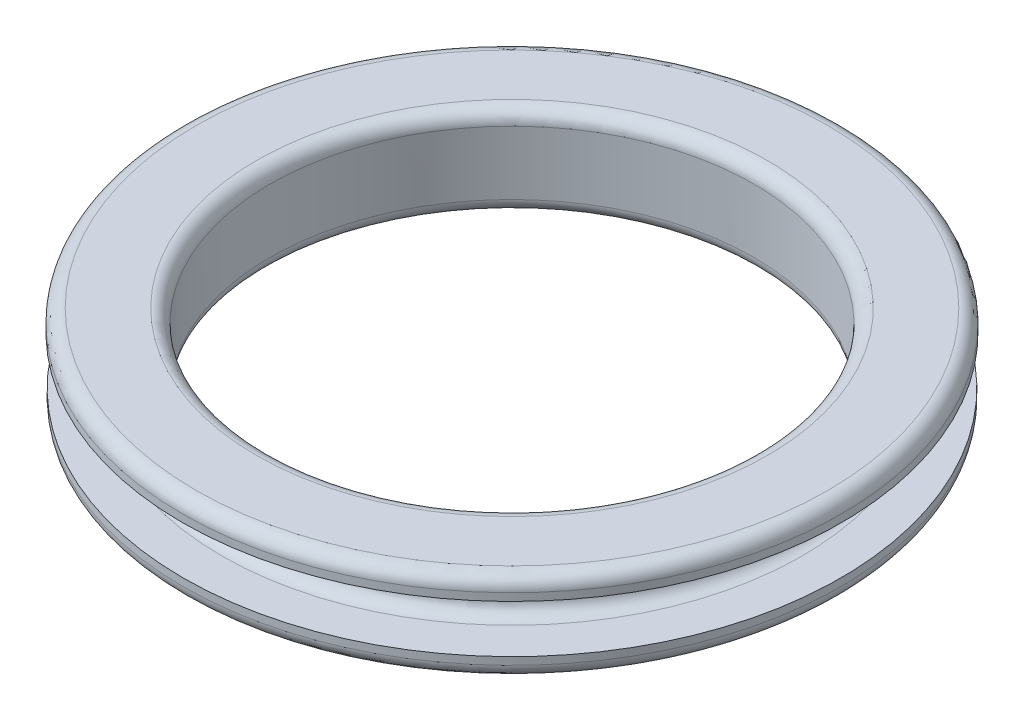
ISO-10303-21;
HEADER;
FILE_DESCRIPTION(('STEP AP214'),'2;1');
FILE_NAME('part.step','',(''),(''),'','','');
FILE_SCHEMA(('AUTOMOTIVE_DESIGN { 1 0 10303 214 1 1 1 1 }'));
ENDSEC;
DATA;
#1=APPLICATION_CONTEXT('core data for automotive mechanical design processes');
#2=APPLICATION_PROTOCOL_DEFINITION('international standard','automotive_design',2000,#1);
#3=PRODUCT_CONTEXT('',#1,'mechanical');
#4=PRODUCT('Part','Part','',(#3));
#5=PRODUCT_RELATED_PRODUCT_CATEGORY('part','',(#4));
#6=PRODUCT_DEFINITION_FORMATION('','',#4);
#7=PRODUCT_DEFINITION_CONTEXT('part definition',#1,'design');
#8=PRODUCT_DEFINITION('design','',#6,#7);
#9=PRODUCT_DEFINITION_SHAPE('','',#8);
#10=(LENGTH_UNIT() NAMED_UNIT(*) SI_UNIT(.MILLI.,.METRE.));
#11=(NAMED_UNIT(*) PLANE_ANGLE_UNIT() SI_UNIT($,.RADIAN.));
#12=(NAMED_UNIT(*) SI_UNIT($,.STERADIAN.) SOLID_ANGLE_UNIT());
#13=UNCERTAINTY_MEASURE_WITH_UNIT(LENGTH_MEASURE(1.E-05),#10,'distance_accuracy_value','');
#14=(GEOMETRIC_REPRESENTATION_CONTEXT(3) GLOBAL_UNCERTAINTY_ASSIGNED_CONTEXT((#13)) GLOBAL_UNIT_ASSIGNED_CONTEXT((#10,
#11,#12)) REPRESENTATION_CONTEXT('',''));
#15=CARTESIAN_POINT('',(0.,0.,0.));
#16=DIRECTION('',(0.,0.,1.));
#17=DIRECTION('',(1.,0.,0.));
#18=AXIS2_PLACEMENT_3D('',#15,#16,#17);
#19=CARTESIAN_POINT('',(-10.8717524104385,0.,0.));
#20=DIRECTION('',(0.,-1.,0.));
#21=DIRECTION('',(0.,0.,-1.));
#22=AXIS2_PLACEMENT_3D('',#19,#20,#21);
#23=PLANE('',#22);
#24=CARTESIAN_POINT('',(0.,0.,0.));
#25=DIRECTION('',(0.,-1.,0.));
#26=DIRECTION('',(0.,0.,-1.));
#27=AXIS2_PLACEMENT_3D('',#24,#25,#26);
#28=CIRCLE('',#27,10.4217524104385);
#29=CARTESIAN_POINT('',(0.,0.,-10.4217524104385));
#30=VERTEX_POINT('',#29);
#31=EDGE_CURVE('E66',#30,#30,#28,.T.);
#32=ORIENTED_EDGE('',*,*,#31,.T.);
#33=EDGE_LOOP('',(#32));
#34=FACE_BOUND('',#33,.T.);
#35=CARTESIAN_POINT('',(0.,0.,0.));
#36=DIRECTION('',(0.,-1.,0.));
#37=DIRECTION('',(0.,0.,-1.));
#38=AXIS2_PLACEMENT_3D('',#35,#36,#37);
#39=CIRCLE('',#38,8.45);
#40=CARTESIAN_POINT('',(0.,0.,-8.45));
#41=VERTEX_POINT('',#40);
#42=EDGE_CURVE('E69',#41,#41,#39,.F.);
#43=ORIENTED_EDGE('',*,*,#42,.T.);
#44=EDGE_LOOP('',(#43));
#45=FACE_BOUND('',#44,.T.);
#46=ADVANCED_FACE('F31',(#34,#45),#23,.T.);
#47=CARTESIAN_POINT('',(0.,7.24686622926984,0.));
#48=DIRECTION('',(0.,1.,0.));
#49=DIRECTION('',(0.,0.,1.));
#50=AXIS2_PLACEMENT_3D('',#47,#48,#49);
#51=CYLINDRICAL_SURFACE('',#50,8.);
#52=CARTESIAN_POINT('',(0.,0.45,0.));
#53=DIRECTION('',(0.,-1.,0.));
#54=DIRECTION('',(0.,0.,-1.));
#55=AXIS2_PLACEMENT_3D('',#52,#53,#54);
#56=CIRCLE('',#55,8.);
#57=CARTESIAN_POINT('',(0.,0.45,-8.));
#58=VERTEX_POINT('',#57);
#59=EDGE_CURVE('E10',#58,#58,#56,.T.);
#60=ORIENTED_EDGE('',*,*,#59,.T.);
#61=EDGE_LOOP('',(#60));
#62=FACE_BOUND('',#61,.T.);
#63=CARTESIAN_POINT('',(0.,2.55,0.));
#64=DIRECTION('',(0.,1.,0.));
#65=DIRECTION('',(0.,0.,1.));
#66=AXIS2_PLACEMENT_3D('',#63,#64,#65);
#67=CIRCLE('',#66,8.);
#68=CARTESIAN_POINT('',(0.,2.55,8.));
#69=VERTEX_POINT('',#68);
#70=EDGE_CURVE('E38',#69,#69,#67,.T.);
#71=ORIENTED_EDGE('',*,*,#70,.T.);
#72=EDGE_LOOP('',(#71));
#73=FACE_BOUND('',#72,.T.);
#74=ADVANCED_FACE('F100',(#62,#73),#51,.F.);
#75=CARTESIAN_POINT('',(-8.,3.,0.));
#76=DIRECTION('',(0.,1.,0.));
#77=DIRECTION('',(0.,0.,1.));
#78=AXIS2_PLACEMENT_3D('',#75,#76,#77);
#79=PLANE('',#78);
#80=CARTESIAN_POINT('',(0.,3.,0.));
#81=DIRECTION('',(0.,1.,0.));
#82=DIRECTION('',(0.,0.,1.));
#83=AXIS2_PLACEMENT_3D('',#80,#81,#82);
#84=CIRCLE('',#83,10.45);
#85=CARTESIAN_POINT('',(0.,3.,10.45));
#86=VERTEX_POINT('',#85);
#87=EDGE_CURVE('E46',#86,#86,#84,.T.);
#88=ORIENTED_EDGE('',*,*,#87,.T.);
#89=EDGE_LOOP('',(#88));
#90=FACE_BOUND('',#89,.T.);
#91=CARTESIAN_POINT('',(0.,3.,0.));
#92=DIRECTION('',(0.,1.,0.));
#93=DIRECTION('',(0.,0.,1.));
#94=AXIS2_PLACEMENT_3D('',#91,#92,#93);
#95=CIRCLE('',#94,8.45);
#96=CARTESIAN_POINT('',(0.,3.,8.45));
#97=VERTEX_POINT('',#96);
#98=EDGE_CURVE('E51',#97,#97,#95,.F.);
#99=ORIENTED_EDGE('',*,*,#98,.T.);
#100=EDGE_LOOP('',(#99));
#101=FACE_BOUND('',#100,.T.);
#102=ADVANCED_FACE('F106',(#90,#101),#79,.T.);
#103=CARTESIAN_POINT('',(0.,7.24686622926984,0.));
#104=DIRECTION('',(0.,1.,0.));
#105=DIRECTION('',(0.,0.,1.));
#106=AXIS2_PLACEMENT_3D('',#103,#104,#105);
#107=CYLINDRICAL_SURFACE('',#106,10.9);
#108=CARTESIAN_POINT('',(0.,2.55,0.));
#109=DIRECTION('',(0.,1.,0.));
#110=DIRECTION('',(0.,0.,1.));
#111=AXIS2_PLACEMENT_3D('',#108,#109,#110);
#112=CIRCLE('',#111,10.9);
#113=CARTESIAN_POINT('',(0.,2.55,10.9));
#114=VERTEX_POINT('',#113);
#115=EDGE_CURVE('E42',#114,#114,#112,.F.);
#116=ORIENTED_EDGE('',*,*,#115,.T.);
#117=EDGE_LOOP('',(#116));
#118=FACE_BOUND('',#117,.T.);
#119=CARTESIAN_POINT('',(0.,2.3,0.));
#120=DIRECTION('',(0.,1.,0.));
#121=DIRECTION('',(0.,0.,1.));
#122=AXIS2_PLACEMENT_3D('',#119,#120,#121);
#123=CIRCLE('',#122,10.9);
#124=CARTESIAN_POINT('',(0.,2.3,10.9));
#125=VERTEX_POINT('',#124);
#126=EDGE_CURVE('E75',#125,#125,#123,.T.);
#127=ORIENTED_EDGE('',*,*,#126,.T.);
#128=EDGE_LOOP('',(#127));
#129=FACE_BOUND('',#128,.T.);
#130=ADVANCED_FACE('F136',(#118,#129),#107,.T.);
#131=CARTESIAN_POINT('',(-10.9,2.3,0.));
#132=DIRECTION('',(0.,-1.,0.));
#133=DIRECTION('',(0.,0.,-1.));
#134=AXIS2_PLACEMENT_3D('',#131,#132,#133);
#135=PLANE('',#134);
#136=CARTESIAN_POINT('',(0.,2.3,0.));
#137=DIRECTION('',(0.,-1.,0.));
#138=DIRECTION('',(0.,0.,-1.));
#139=AXIS2_PLACEMENT_3D('',#136,#137,#138);
#140=CIRCLE('',#139,9.60341347171669);
#141=CARTESIAN_POINT('',(0.,2.3,-9.60341347171669));
#142=VERTEX_POINT('',#141);
#143=EDGE_CURVE('E54',#142,#142,#140,.F.);
#144=ORIENTED_EDGE('',*,*,#143,.T.);
#145=EDGE_LOOP('',(#144));
#146=FACE_BOUND('',#145,.T.);
#147=ORIENTED_EDGE('',*,*,#126,.F.);
#148=EDGE_LOOP('',(#147));
#149=FACE_BOUND('',#148,.T.);
#150=ADVANCED_FACE('F141',(#146,#149),#135,.T.);
#151=CARTESIAN_POINT('',(0.,7.24686622926984,0.));
#152=DIRECTION('',(0.,1.,0.));
#153=DIRECTION('',(0.,0.,1.));
#154=AXIS2_PLACEMENT_3D('',#151,#152,#153);
#155=CYLINDRICAL_SURFACE('',#154,9.15341347171669);
#156=CARTESIAN_POINT('',(0.,1.15,0.));
#157=DIRECTION('',(0.,1.,0.));
#158=DIRECTION('',(0.,0.,1.));
#159=AXIS2_PLACEMENT_3D('',#156,#157,#158);
#160=CIRCLE('',#159,9.15341347171669);
#161=CARTESIAN_POINT('',(0.,1.15,9.15341347171669));
#162=VERTEX_POINT('',#161);
#163=EDGE_CURVE('E60',#162,#162,#160,.T.);
#164=ORIENTED_EDGE('',*,*,#163,.T.);
#165=EDGE_LOOP('',(#164));
#166=FACE_BOUND('',#165,.T.);
#167=CARTESIAN_POINT('',(0.,1.85,0.));
#168=DIRECTION('',(0.,-1.,0.));
#169=DIRECTION('',(0.,0.,-1.));
#170=AXIS2_PLACEMENT_3D('',#167,#168,#169);
#171=CIRCLE('',#170,9.15341347171669);
#172=CARTESIAN_POINT('',(0.,1.85,-9.15341347171669));
#173=VERTEX_POINT('',#172);
#174=EDGE_CURVE('E63',#173,#173,#171,.T.);
#175=ORIENTED_EDGE('',*,*,#174,.T.);
#176=EDGE_LOOP('',(#175));
#177=FACE_BOUND('',#176,.T.);
#178=ADVANCED_FACE('F96',(#166,#177),#155,.T.);
#179=CARTESIAN_POINT('',(-9.15341347171669,0.7,0.));
#180=DIRECTION('',(0.,1.,0.));
#181=DIRECTION('',(0.,0.,1.));
#182=AXIS2_PLACEMENT_3D('',#179,#180,#181);
#183=PLANE('',#182);
#184=CARTESIAN_POINT('',(0.,0.7,0.));
#185=DIRECTION('',(0.,1.,0.));
#186=DIRECTION('',(0.,0.,1.));
#187=AXIS2_PLACEMENT_3D('',#184,#185,#186);
#188=CIRCLE('',#187,9.60341347171669);
#189=CARTESIAN_POINT('',(0.,0.7,9.60341347171669));
#190=VERTEX_POINT('',#189);
#191=EDGE_CURVE('E57',#190,#190,#188,.F.);
#192=ORIENTED_EDGE('',*,*,#191,.T.);
#193=EDGE_LOOP('',(#192));
#194=FACE_BOUND('',#193,.T.);
#195=CARTESIAN_POINT('',(0.,0.7,0.));
#196=DIRECTION('',(0.,1.,0.));
#197=DIRECTION('',(0.,0.,1.));
#198=AXIS2_PLACEMENT_3D('',#195,#196,#197);
#199=CIRCLE('',#198,10.8717524104385);
#200=CARTESIAN_POINT('',(0.,0.7,10.8717524104385));
#201=VERTEX_POINT('',#200);
#202=EDGE_CURVE('E78',#201,#201,#199,.T.);
#203=ORIENTED_EDGE('',*,*,#202,.T.);
#204=EDGE_LOOP('',(#203));
#205=FACE_BOUND('',#204,.T.);
#206=ADVANCED_FACE('F82',(#194,#205),#183,.T.);
#207=CARTESIAN_POINT('',(0.,7.24686622926984,0.));
#208=DIRECTION('',(0.,1.,0.));
#209=DIRECTION('',(0.,0.,1.));
#210=AXIS2_PLACEMENT_3D('',#207,#208,#209);
#211=CYLINDRICAL_SURFACE('',#210,10.8717524104385);
#212=CARTESIAN_POINT('',(0.,0.45,0.));
#213=DIRECTION('',(0.,-1.,0.));
#214=DIRECTION('',(0.,0.,-1.));
#215=AXIS2_PLACEMENT_3D('',#212,#213,#214);
#216=CIRCLE('',#215,10.8717524104385);
#217=CARTESIAN_POINT('',(0.,0.45,-10.8717524104385));
#218=VERTEX_POINT('',#217);
#219=EDGE_CURVE('E72',#218,#218,#216,.F.);
#220=ORIENTED_EDGE('',*,*,#219,.T.);
#221=EDGE_LOOP('',(#220));
#222=FACE_BOUND('',#221,.T.);
#223=ORIENTED_EDGE('',*,*,#202,.F.);
#224=EDGE_LOOP('',(#223));
#225=FACE_BOUND('',#224,.T.);
#226=ADVANCED_FACE('F84',(#222,#225),#211,.T.);
#227=CARTESIAN_POINT('',(0.,0.45,0.));
#228=DIRECTION('',(0.,-1.,0.));
#229=DIRECTION('',(0.,0.,-1.));
#230=AXIS2_PLACEMENT_3D('',#227,#228,#229);
#231=TOROIDAL_SURFACE('',#230,10.4217524104385,0.45);
#232=ORIENTED_EDGE('',*,*,#31,.F.);
#233=EDGE_LOOP('',(#232));
#234=FACE_BOUND('',#233,.T.);
#235=ORIENTED_EDGE('',*,*,#219,.F.);
#236=EDGE_LOOP('',(#235));
#237=FACE_BOUND('',#236,.T.);
#238=ADVANCED_FACE('F86',(#234,#237),#231,.T.);
#239=CARTESIAN_POINT('',(0.,1.15,0.));
#240=DIRECTION('',(0.,1.,0.));
#241=DIRECTION('',(0.,0.,1.));
#242=AXIS2_PLACEMENT_3D('',#239,#240,#241);
#243=TOROIDAL_SURFACE('',#242,9.60341347171669,0.45);
#244=ORIENTED_EDGE('',*,*,#191,.F.);
#245=EDGE_LOOP('',(#244));
#246=FACE_BOUND('',#245,.T.);
#247=ORIENTED_EDGE('',*,*,#163,.F.);
#248=EDGE_LOOP('',(#247));
#249=FACE_BOUND('',#248,.T.);
#250=ADVANCED_FACE('F93',(#246,#249),#243,.F.);
#251=CARTESIAN_POINT('',(0.,1.85,0.));
#252=DIRECTION('',(0.,-1.,0.));
#253=DIRECTION('',(0.,0.,-1.));
#254=AXIS2_PLACEMENT_3D('',#251,#252,#253);
#255=TOROIDAL_SURFACE('',#254,9.60341347171669,0.45);
#256=ORIENTED_EDGE('',*,*,#174,.F.);
#257=EDGE_LOOP('',(#256));
#258=FACE_BOUND('',#257,.T.);
#259=ORIENTED_EDGE('',*,*,#143,.F.);
#260=EDGE_LOOP('',(#259));
#261=FACE_BOUND('',#260,.T.);
#262=ADVANCED_FACE('F113',(#258,#261),#255,.F.);
#263=CARTESIAN_POINT('',(0.,2.55,0.));
#264=DIRECTION('',(0.,1.,0.));
#265=DIRECTION('',(0.,0.,1.));
#266=AXIS2_PLACEMENT_3D('',#263,#264,#265);
#267=TOROIDAL_SURFACE('',#266,10.45,0.45);
#268=ORIENTED_EDGE('',*,*,#115,.F.);
#269=EDGE_LOOP('',(#268));
#270=FACE_BOUND('',#269,.T.);
#271=ORIENTED_EDGE('',*,*,#87,.F.);
#272=EDGE_LOOP('',(#271));
#273=FACE_BOUND('',#272,.T.);
#274=ADVANCED_FACE('F117',(#270,#273),#267,.T.);
#275=CARTESIAN_POINT('',(0.,0.45,0.));
#276=DIRECTION('',(0.,-1.,0.));
#277=DIRECTION('',(0.,0.,-1.));
#278=AXIS2_PLACEMENT_3D('',#275,#276,#277);
#279=TOROIDAL_SURFACE('',#278,8.45,0.45);
#280=ORIENTED_EDGE('',*,*,#59,.F.);
#281=EDGE_LOOP('',(#280));
#282=FACE_BOUND('',#281,.T.);
#283=ORIENTED_EDGE('',*,*,#42,.F.);
#284=EDGE_LOOP('',(#283));
#285=FACE_BOUND('',#284,.T.);
#286=ADVANCED_FACE('F120',(#282,#285),#279,.T.);
#287=CARTESIAN_POINT('',(0.,2.55,0.));
#288=DIRECTION('',(0.,1.,0.));
#289=DIRECTION('',(0.,0.,1.));
#290=AXIS2_PLACEMENT_3D('',#287,#288,#289);
#291=TOROIDAL_SURFACE('',#290,8.45,0.45);
#292=ORIENTED_EDGE('',*,*,#98,.F.);
#293=EDGE_LOOP('',(#292));
#294=FACE_BOUND('',#293,.T.);
#295=ORIENTED_EDGE('',*,*,#70,.F.);
#296=EDGE_LOOP('',(#295));
#297=FACE_BOUND('',#296,.T.);
#298=ADVANCED_FACE('F33',(#294,#297),#291,.T.);
#299=CLOSED_SHELL('',(#46,#74,#102,#130,#150,#178,#206,#226,#238,#250,#262,#274,#286,#298));
#300=MANIFOLD_SOLID_BREP('B2',#299);
#301=ADVANCED_BREP_SHAPE_REPRESENTATION('',(#18,#300),#14);
#302=SHAPE_DEFINITION_REPRESENTATION(#9,#301);
ENDSEC;
END-ISO-10303-21;
